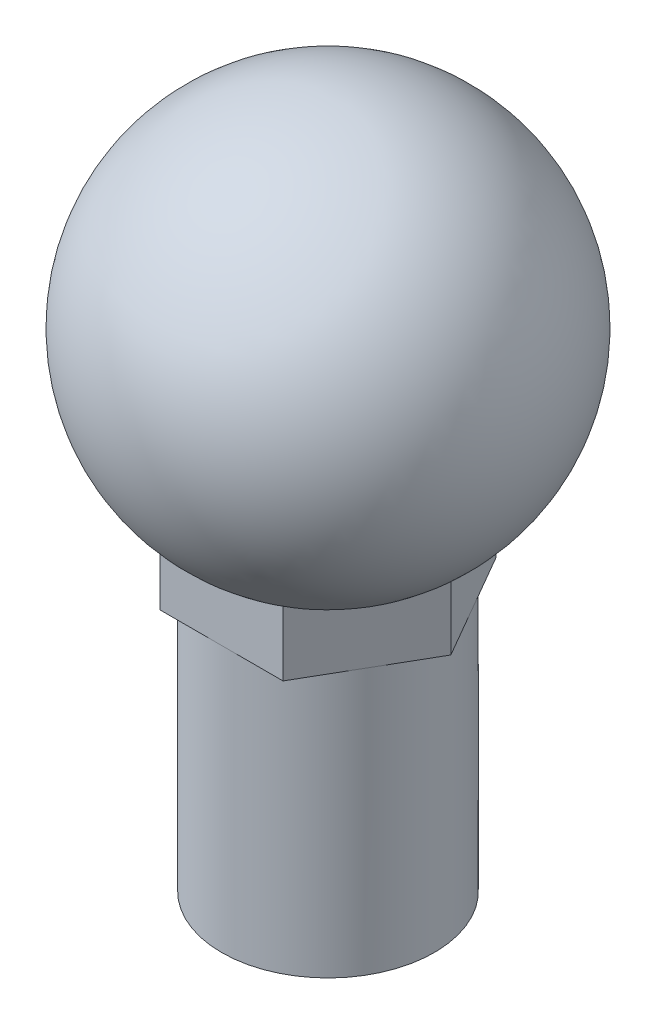
ISO-10303-21;
HEADER;
FILE_DESCRIPTION(('STEP AP214'),'2;1');
FILE_NAME('part.step','',(''),(''),'','','');
FILE_SCHEMA(('AUTOMOTIVE_DESIGN { 1 0 10303 214 1 1 1 1 }'));
ENDSEC;
DATA;
#1=APPLICATION_CONTEXT('core data for automotive mechanical design processes');
#2=APPLICATION_PROTOCOL_DEFINITION('international standard','automotive_design',2000,#1);
#3=PRODUCT_CONTEXT('',#1,'mechanical');
#4=PRODUCT('Part','Part','',(#3));
#5=PRODUCT_RELATED_PRODUCT_CATEGORY('part','',(#4));
#6=PRODUCT_DEFINITION_FORMATION('','',#4);
#7=PRODUCT_DEFINITION_CONTEXT('part definition',#1,'design');
#8=PRODUCT_DEFINITION('design','',#6,#7);
#9=PRODUCT_DEFINITION_SHAPE('','',#8);
#10=(LENGTH_UNIT() NAMED_UNIT(*) SI_UNIT(.MILLI.,.METRE.));
#11=(NAMED_UNIT(*) PLANE_ANGLE_UNIT() SI_UNIT($,.RADIAN.));
#12=(NAMED_UNIT(*) SI_UNIT($,.STERADIAN.) SOLID_ANGLE_UNIT());
#13=UNCERTAINTY_MEASURE_WITH_UNIT(LENGTH_MEASURE(1.E-05),#10,'distance_accuracy_value','');
#14=(GEOMETRIC_REPRESENTATION_CONTEXT(3) GLOBAL_UNCERTAINTY_ASSIGNED_CONTEXT((#13)) GLOBAL_UNIT_ASSIGNED_CONTEXT((#10,
#11,#12)) REPRESENTATION_CONTEXT('',''));
#15=CARTESIAN_POINT('',(0.,0.,0.));
#16=DIRECTION('',(0.,0.,1.));
#17=DIRECTION('',(1.,0.,0.));
#18=AXIS2_PLACEMENT_3D('',#15,#16,#17);
#19=CARTESIAN_POINT('',(0.,12.,0.));
#20=DIRECTION('',(0.,-1.,0.));
#21=DIRECTION('',(0.,0.,-1.));
#22=AXIS2_PLACEMENT_3D('',#19,#20,#21);
#23=CYLINDRICAL_SURFACE('',#22,4.);
#24=CARTESIAN_POINT('',(0.,10.,0.));
#25=DIRECTION('',(0.,-1.,0.));
#26=DIRECTION('',(0.,0.,-1.));
#27=AXIS2_PLACEMENT_3D('',#24,#25,#26);
#28=CIRCLE('',#27,4.);
#29=CARTESIAN_POINT('',(-3.46410161513775,10.,-2.));
#30=VERTEX_POINT('',#29);
#31=CARTESIAN_POINT('',(0.,10.,-4.));
#32=VERTEX_POINT('',#31);
#33=EDGE_CURVE('E44',#30,#32,#28,.T.);
#34=ORIENTED_EDGE('',*,*,#33,.T.);
#35=CARTESIAN_POINT('',(3.46410161513775,10.,-2.));
#36=VERTEX_POINT('',#35);
#37=EDGE_CURVE('E11',#32,#36,#28,.T.);
#38=ORIENTED_EDGE('',*,*,#37,.T.);
#39=CARTESIAN_POINT('',(3.46410161513775,10.,2.));
#40=VERTEX_POINT('',#39);
#41=EDGE_CURVE('E50',#36,#40,#28,.T.);
#42=ORIENTED_EDGE('',*,*,#41,.T.);
#43=CARTESIAN_POINT('',(0.,10.,4.));
#44=VERTEX_POINT('',#43);
#45=EDGE_CURVE('E177',#40,#44,#28,.T.);
#46=ORIENTED_EDGE('',*,*,#45,.T.);
#47=CARTESIAN_POINT('',(-3.46410161513775,10.,2.));
#48=VERTEX_POINT('',#47);
#49=EDGE_CURVE('E173',#44,#48,#28,.T.);
#50=ORIENTED_EDGE('',*,*,#49,.T.);
#51=EDGE_CURVE('E168',#48,#30,#28,.T.);
#52=ORIENTED_EDGE('',*,*,#51,.T.);
#53=EDGE_LOOP('',(#34,#38,#42,#46,#50,#52));
#54=FACE_BOUND('',#53,.T.);
#55=CARTESIAN_POINT('',(0.,0.,0.));
#56=DIRECTION('',(0.,1.,0.));
#57=DIRECTION('',(0.,0.,1.));
#58=AXIS2_PLACEMENT_3D('',#55,#56,#57);
#59=CIRCLE('',#58,4.);
#60=CARTESIAN_POINT('',(0.,0.,4.));
#61=VERTEX_POINT('',#60);
#62=EDGE_CURVE('E135',#61,#61,#59,.T.);
#63=ORIENTED_EDGE('',*,*,#62,.T.);
#64=EDGE_LOOP('',(#63));
#65=FACE_BOUND('',#64,.T.);
#66=ADVANCED_FACE('F41',(#54,#65),#23,.T.);
#67=CARTESIAN_POINT('',(0.,0.,0.));
#68=DIRECTION('',(0.,1.,0.));
#69=DIRECTION('',(0.,0.,1.));
#70=AXIS2_PLACEMENT_3D('',#67,#68,#69);
#71=PLANE('',#70);
#72=ORIENTED_EDGE('',*,*,#62,.F.);
#73=EDGE_LOOP('',(#72));
#74=FACE_BOUND('',#73,.T.);
#75=ADVANCED_FACE('F278',(#74),#71,.F.);
#76=CARTESIAN_POINT('',(0.,10.,0.));
#77=DIRECTION('',(0.,-1.,0.));
#78=DIRECTION('',(0.,0.,-1.));
#79=AXIS2_PLACEMENT_3D('',#76,#77,#78);
#80=PLANE('',#79);
#81=ORIENTED_EDGE('',*,*,#37,.F.);
#82=DIRECTION('',(1.,0.,0.));
#83=VECTOR('',#82,1.);
#84=CARTESIAN_POINT('',(-2.3094010767585,10.,-4.));
#85=LINE('',#84,#83);
#86=CARTESIAN_POINT('',(2.3094010767585,10.,-4.));
#87=VERTEX_POINT('',#86);
#88=EDGE_CURVE('E126',#32,#87,#85,.T.);
#89=ORIENTED_EDGE('',*,*,#88,.T.);
#90=DIRECTION('',(0.5,0.,0.866025403784439));
#91=VECTOR('',#90,1.);
#92=CARTESIAN_POINT('',(2.3094010767585,10.,-4.));
#93=LINE('',#92,#91);
#94=EDGE_CURVE('E197',#87,#36,#93,.T.);
#95=ORIENTED_EDGE('',*,*,#94,.T.);
#96=EDGE_LOOP('',(#81,#89,#95));
#97=FACE_BOUND('',#96,.T.);
#98=ADVANCED_FACE('F202',(#97),#80,.T.);
#99=ORIENTED_EDGE('',*,*,#41,.F.);
#100=CARTESIAN_POINT('',(4.61880215351701,10.,0.));
#101=VERTEX_POINT('',#100);
#102=EDGE_CURVE('E129',#36,#101,#93,.T.);
#103=ORIENTED_EDGE('',*,*,#102,.T.);
#104=DIRECTION('',(-0.5,0.,0.866025403784439));
#105=VECTOR('',#104,1.);
#106=CARTESIAN_POINT('',(4.61880215351701,10.,0.));
#107=LINE('',#106,#105);
#108=EDGE_CURVE('E192',#101,#40,#107,.T.);
#109=ORIENTED_EDGE('',*,*,#108,.T.);
#110=EDGE_LOOP('',(#99,#103,#109));
#111=FACE_BOUND('',#110,.T.);
#112=ADVANCED_FACE('F189',(#111),#80,.T.);
#113=ORIENTED_EDGE('',*,*,#45,.F.);
#114=CARTESIAN_POINT('',(2.3094010767585,10.,4.));
#115=VERTEX_POINT('',#114);
#116=EDGE_CURVE('E204',#40,#115,#107,.T.);
#117=ORIENTED_EDGE('',*,*,#116,.T.);
#118=DIRECTION('',(-1.,0.,0.));
#119=VECTOR('',#118,1.);
#120=CARTESIAN_POINT('',(2.3094010767585,10.,4.));
#121=LINE('',#120,#119);
#122=EDGE_CURVE('E211',#115,#44,#121,.T.);
#123=ORIENTED_EDGE('',*,*,#122,.T.);
#124=EDGE_LOOP('',(#113,#117,#123));
#125=FACE_BOUND('',#124,.T.);
#126=ADVANCED_FACE('F238',(#125),#80,.T.);
#127=ORIENTED_EDGE('',*,*,#49,.F.);
#128=CARTESIAN_POINT('',(-2.3094010767585,10.,4.));
#129=VERTEX_POINT('',#128);
#130=EDGE_CURVE('E210',#44,#129,#121,.T.);
#131=ORIENTED_EDGE('',*,*,#130,.T.);
#132=DIRECTION('',(-0.5,0.,-0.866025403784439));
#133=VECTOR('',#132,1.);
#134=CARTESIAN_POINT('',(-2.3094010767585,10.,4.));
#135=LINE('',#134,#133);
#136=EDGE_CURVE('E216',#129,#48,#135,.T.);
#137=ORIENTED_EDGE('',*,*,#136,.T.);
#138=EDGE_LOOP('',(#127,#131,#137));
#139=FACE_BOUND('',#138,.T.);
#140=ADVANCED_FACE('F304',(#139),#80,.T.);
#141=ORIENTED_EDGE('',*,*,#51,.F.);
#142=CARTESIAN_POINT('',(-4.61880215351701,10.,0.));
#143=VERTEX_POINT('',#142);
#144=EDGE_CURVE('E215',#48,#143,#135,.T.);
#145=ORIENTED_EDGE('',*,*,#144,.T.);
#146=DIRECTION('',(0.5,0.,-0.866025403784439));
#147=VECTOR('',#146,1.);
#148=CARTESIAN_POINT('',(-4.61880215351701,10.,0.));
#149=LINE('',#148,#147);
#150=EDGE_CURVE('E119',#143,#30,#149,.T.);
#151=ORIENTED_EDGE('',*,*,#150,.T.);
#152=EDGE_LOOP('',(#141,#145,#151));
#153=FACE_BOUND('',#152,.T.);
#154=ADVANCED_FACE('F259',(#153),#80,.T.);
#155=CARTESIAN_POINT('',(-4.61880215351701,10.,0.));
#156=DIRECTION('',(0.866025403784438,0.,0.5));
#157=DIRECTION('',(0.5,0.,-0.866025403784439));
#158=AXIS2_PLACEMENT_3D('',#155,#156,#157);
#159=PLANE('',#158);
#160=CARTESIAN_POINT('',(-2.3094010767585,10.,-4.));
#161=VERTEX_POINT('',#160);
#162=EDGE_CURVE('E111',#30,#161,#149,.T.);
#163=ORIENTED_EDGE('',*,*,#162,.F.);
#164=ORIENTED_EDGE('',*,*,#150,.F.);
#165=DIRECTION('',(0.,1.,0.));
#166=VECTOR('',#165,1.);
#167=CARTESIAN_POINT('',(-4.61880215351701,10.,0.));
#168=LINE('',#167,#166);
#169=CARTESIAN_POINT('',(-4.61880215351701,12.4352561364795,0.));
#170=VERTEX_POINT('',#169);
#171=EDGE_CURVE('E220',#143,#170,#168,.T.);
#172=ORIENTED_EDGE('',*,*,#171,.T.);
#173=CARTESIAN_POINT('',(-3.46410161513775,18.3442887702248,-2.));
#174=DIRECTION('',(0.866025403784438,0.,0.5));
#175=DIRECTION('',(0.5,0.,-0.866025403784439));
#176=AXIS2_PLACEMENT_3D('',#173,#174,#175);
#177=CIRCLE('',#176,6.34428877022476);
#178=CARTESIAN_POINT('',(-2.3094010767585,12.4352561364795,-4.));
#179=VERTEX_POINT('',#178);
#180=EDGE_CURVE('E133',#170,#179,#177,.T.);
#181=ORIENTED_EDGE('',*,*,#180,.T.);
#182=DIRECTION('',(0.,1.,0.));
#183=VECTOR('',#182,1.);
#184=CARTESIAN_POINT('',(-2.3094010767585,10.,-4.));
#185=LINE('',#184,#183);
#186=EDGE_CURVE('E124',#161,#179,#185,.T.);
#187=ORIENTED_EDGE('',*,*,#186,.F.);
#188=EDGE_LOOP('',(#163,#164,#172,#181,#187));
#189=FACE_BOUND('',#188,.T.);
#190=ADVANCED_FACE('F131',(#189),#159,.F.);
#191=CARTESIAN_POINT('',(-2.3094010767585,10.,-4.));
#192=DIRECTION('',(0.,0.,1.));
#193=DIRECTION('',(1.,0.,0.));
#194=AXIS2_PLACEMENT_3D('',#191,#192,#193);
#195=PLANE('',#194);
#196=ORIENTED_EDGE('',*,*,#88,.F.);
#197=EDGE_CURVE('E57',#161,#32,#85,.T.);
#198=ORIENTED_EDGE('',*,*,#197,.F.);
#199=ORIENTED_EDGE('',*,*,#186,.T.);
#200=CARTESIAN_POINT('',(0.,18.3442887702248,-4.));
#201=DIRECTION('',(0.,0.,1.));
#202=DIRECTION('',(1.,0.,0.));
#203=AXIS2_PLACEMENT_3D('',#200,#201,#202);
#204=CIRCLE('',#203,6.34428877022476);
#205=CARTESIAN_POINT('',(2.3094010767585,12.4352561364795,-4.));
#206=VERTEX_POINT('',#205);
#207=EDGE_CURVE('E65',#179,#206,#204,.T.);
#208=ORIENTED_EDGE('',*,*,#207,.T.);
#209=DIRECTION('',(0.,1.,0.));
#210=VECTOR('',#209,1.);
#211=CARTESIAN_POINT('',(2.3094010767585,10.,-4.));
#212=LINE('',#211,#210);
#213=EDGE_CURVE('E136',#87,#206,#212,.T.);
#214=ORIENTED_EDGE('',*,*,#213,.F.);
#215=EDGE_LOOP('',(#196,#198,#199,#208,#214));
#216=FACE_BOUND('',#215,.T.);
#217=ADVANCED_FACE('F123',(#216),#195,.F.);
#218=CARTESIAN_POINT('',(2.3094010767585,10.,-4.));
#219=DIRECTION('',(-0.866025403784438,0.,0.5));
#220=DIRECTION('',(0.5,0.,0.866025403784439));
#221=AXIS2_PLACEMENT_3D('',#218,#219,#220);
#222=PLANE('',#221);
#223=ORIENTED_EDGE('',*,*,#102,.F.);
#224=ORIENTED_EDGE('',*,*,#94,.F.);
#225=ORIENTED_EDGE('',*,*,#213,.T.);
#226=CARTESIAN_POINT('',(3.46410161513775,18.3442887702248,-2.));
#227=DIRECTION('',(-0.866025403784438,0.,0.5));
#228=DIRECTION('',(0.5,0.,0.866025403784439));
#229=AXIS2_PLACEMENT_3D('',#226,#227,#228);
#230=CIRCLE('',#229,6.34428877022476);
#231=CARTESIAN_POINT('',(4.61880215351701,12.4352561364795,0.));
#232=VERTEX_POINT('',#231);
#233=EDGE_CURVE('E160',#206,#232,#230,.T.);
#234=ORIENTED_EDGE('',*,*,#233,.T.);
#235=DIRECTION('',(0.,1.,0.));
#236=VECTOR('',#235,1.);
#237=CARTESIAN_POINT('',(4.61880215351701,10.,0.));
#238=LINE('',#237,#236);
#239=EDGE_CURVE('E145',#101,#232,#238,.T.);
#240=ORIENTED_EDGE('',*,*,#239,.F.);
#241=EDGE_LOOP('',(#223,#224,#225,#234,#240));
#242=FACE_BOUND('',#241,.T.);
#243=ADVANCED_FACE('F196',(#242),#222,.F.);
#244=CARTESIAN_POINT('',(4.61880215351701,10.,0.));
#245=DIRECTION('',(-0.866025403784439,0.,-0.5));
#246=DIRECTION('',(-0.5,0.,0.866025403784439));
#247=AXIS2_PLACEMENT_3D('',#244,#245,#246);
#248=PLANE('',#247);
#249=ORIENTED_EDGE('',*,*,#116,.F.);
#250=ORIENTED_EDGE('',*,*,#108,.F.);
#251=ORIENTED_EDGE('',*,*,#239,.T.);
#252=CARTESIAN_POINT('',(3.46410161513775,18.3442887702248,2.));
#253=DIRECTION('',(-0.866025403784439,0.,-0.5));
#254=DIRECTION('',(-0.5,0.,0.866025403784439));
#255=AXIS2_PLACEMENT_3D('',#252,#253,#254);
#256=CIRCLE('',#255,6.34428877022476);
#257=CARTESIAN_POINT('',(2.3094010767585,12.4352561364795,4.));
#258=VERTEX_POINT('',#257);
#259=EDGE_CURVE('E156',#232,#258,#256,.T.);
#260=ORIENTED_EDGE('',*,*,#259,.T.);
#261=DIRECTION('',(0.,1.,0.));
#262=VECTOR('',#261,1.);
#263=CARTESIAN_POINT('',(2.3094010767585,10.,4.));
#264=LINE('',#263,#262);
#265=EDGE_CURVE('E227',#115,#258,#264,.T.);
#266=ORIENTED_EDGE('',*,*,#265,.F.);
#267=EDGE_LOOP('',(#249,#250,#251,#260,#266));
#268=FACE_BOUND('',#267,.T.);
#269=ADVANCED_FACE('F234',(#268),#248,.F.);
#270=CARTESIAN_POINT('',(2.3094010767585,10.,4.));
#271=DIRECTION('',(0.,0.,-1.));
#272=DIRECTION('',(-1.,0.,0.));
#273=AXIS2_PLACEMENT_3D('',#270,#271,#272);
#274=PLANE('',#273);
#275=ORIENTED_EDGE('',*,*,#130,.F.);
#276=ORIENTED_EDGE('',*,*,#122,.F.);
#277=ORIENTED_EDGE('',*,*,#265,.T.);
#278=CARTESIAN_POINT('',(0.,18.3442887702248,4.));
#279=DIRECTION('',(0.,0.,-1.));
#280=DIRECTION('',(-1.,0.,0.));
#281=AXIS2_PLACEMENT_3D('',#278,#279,#280);
#282=CIRCLE('',#281,6.34428877022476);
#283=CARTESIAN_POINT('',(-2.3094010767585,12.4352561364795,4.));
#284=VERTEX_POINT('',#283);
#285=EDGE_CURVE('E152',#258,#284,#282,.T.);
#286=ORIENTED_EDGE('',*,*,#285,.T.);
#287=DIRECTION('',(0.,1.,0.));
#288=VECTOR('',#287,1.);
#289=CARTESIAN_POINT('',(-2.3094010767585,10.,4.));
#290=LINE('',#289,#288);
#291=EDGE_CURVE('E223',#129,#284,#290,.T.);
#292=ORIENTED_EDGE('',*,*,#291,.F.);
#293=EDGE_LOOP('',(#275,#276,#277,#286,#292));
#294=FACE_BOUND('',#293,.T.);
#295=ADVANCED_FACE('F241',(#294),#274,.F.);
#296=CARTESIAN_POINT('',(-2.3094010767585,10.,4.));
#297=DIRECTION('',(0.866025403784439,0.,-0.5));
#298=DIRECTION('',(-0.5,0.,-0.866025403784439));
#299=AXIS2_PLACEMENT_3D('',#296,#297,#298);
#300=PLANE('',#299);
#301=ORIENTED_EDGE('',*,*,#144,.F.);
#302=ORIENTED_EDGE('',*,*,#136,.F.);
#303=ORIENTED_EDGE('',*,*,#291,.T.);
#304=CARTESIAN_POINT('',(-3.46410161513775,18.3442887702248,2.));
#305=DIRECTION('',(0.866025403784439,0.,-0.5));
#306=DIRECTION('',(-0.5,0.,-0.866025403784439));
#307=AXIS2_PLACEMENT_3D('',#304,#305,#306);
#308=CIRCLE('',#307,6.34428877022476);
#309=EDGE_CURVE('E142',#284,#170,#308,.T.);
#310=ORIENTED_EDGE('',*,*,#309,.T.);
#311=ORIENTED_EDGE('',*,*,#171,.F.);
#312=EDGE_LOOP('',(#301,#302,#303,#310,#311));
#313=FACE_BOUND('',#312,.T.);
#314=ADVANCED_FACE('F261',(#313),#300,.F.);
#315=ORIENTED_EDGE('',*,*,#33,.F.);
#316=ORIENTED_EDGE('',*,*,#162,.T.);
#317=ORIENTED_EDGE('',*,*,#197,.T.);
#318=EDGE_LOOP('',(#315,#316,#317));
#319=FACE_BOUND('',#318,.T.);
#320=ADVANCED_FACE('F112',(#319),#80,.T.);
#321=CARTESIAN_POINT('',(0.,18.3442887702248,0.));
#322=DIRECTION('',(0.,1.,0.));
#323=DIRECTION('',(1.,0.,0.));
#324=AXIS2_PLACEMENT_3D('',#321,#322,#323);
#325=SPHERICAL_SURFACE('',#324,7.5);
#326=ORIENTED_EDGE('',*,*,#180,.F.);
#327=ORIENTED_EDGE('',*,*,#309,.F.);
#328=ORIENTED_EDGE('',*,*,#285,.F.);
#329=ORIENTED_EDGE('',*,*,#259,.F.);
#330=ORIENTED_EDGE('',*,*,#233,.F.);
#331=ORIENTED_EDGE('',*,*,#207,.F.);
#332=EDGE_LOOP('',(#326,#327,#328,#329,#330,#331));
#333=FACE_BOUND('',#332,.T.);
#334=ADVANCED_FACE('F269',(#333),#325,.T.);
#335=CLOSED_SHELL('',(#66,#75,#98,#112,#126,#140,#154,#190,#217,#243,#269,#295,#314,#320,#334));
#336=MANIFOLD_SOLID_BREP('B2',#335);
#337=ADVANCED_BREP_SHAPE_REPRESENTATION('',(#18,#336),#14);
#338=SHAPE_DEFINITION_REPRESENTATION(#9,#337);
ENDSEC;
END-ISO-10303-21;
